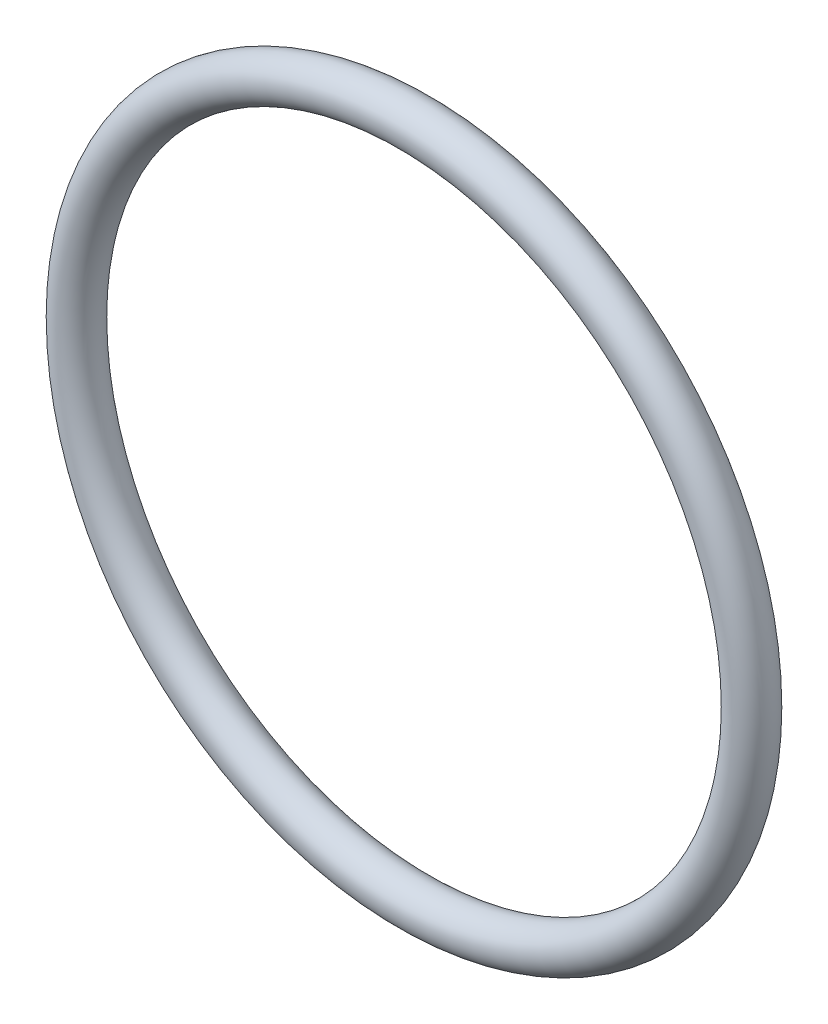
ISO-10303-21;
HEADER;
FILE_DESCRIPTION(('STEP AP214'),'2;1');
FILE_NAME('part.step','',(''),(''),'','','');
FILE_SCHEMA(('AUTOMOTIVE_DESIGN { 1 0 10303 214 1 1 1 1 }'));
ENDSEC;
DATA;
#1=APPLICATION_CONTEXT('core data for automotive mechanical design processes');
#2=APPLICATION_PROTOCOL_DEFINITION('international standard','automotive_design',2000,#1);
#3=PRODUCT_CONTEXT('',#1,'mechanical');
#4=PRODUCT('Part','Part','',(#3));
#5=PRODUCT_RELATED_PRODUCT_CATEGORY('part','',(#4));
#6=PRODUCT_DEFINITION_FORMATION('','',#4);
#7=PRODUCT_DEFINITION_CONTEXT('part definition',#1,'design');
#8=PRODUCT_DEFINITION('design','',#6,#7);
#9=PRODUCT_DEFINITION_SHAPE('','',#8);
#10=(LENGTH_UNIT() NAMED_UNIT(*) SI_UNIT(.MILLI.,.METRE.));
#11=(NAMED_UNIT(*) PLANE_ANGLE_UNIT() SI_UNIT($,.RADIAN.));
#12=(NAMED_UNIT(*) SI_UNIT($,.STERADIAN.) SOLID_ANGLE_UNIT());
#13=UNCERTAINTY_MEASURE_WITH_UNIT(LENGTH_MEASURE(1.E-05),#10,'distance_accuracy_value','');
#14=(GEOMETRIC_REPRESENTATION_CONTEXT(3) GLOBAL_UNCERTAINTY_ASSIGNED_CONTEXT((#13)) GLOBAL_UNIT_ASSIGNED_CONTEXT((#10,
#11,#12)) REPRESENTATION_CONTEXT('',''));
#15=CARTESIAN_POINT('',(0.,0.,0.));
#16=DIRECTION('',(0.,0.,1.));
#17=DIRECTION('',(1.,0.,0.));
#18=AXIS2_PLACEMENT_3D('',#15,#16,#17);
#19=CARTESIAN_POINT('',(0.,0.,0.));
#20=DIRECTION('',(0.,0.,1.));
#21=DIRECTION('',(1.,0.,0.));
#22=AXIS2_PLACEMENT_3D('',#19,#20,#21);
#23=TOROIDAL_SURFACE('',#22,42.037,2.667);
#24=CARTESIAN_POINT('',(44.704,0.,0.));
#25=VERTEX_POINT('',#24);
#26=VERTEX_LOOP('',#25);
#27=FACE_BOUND('',#26,.T.);
#28=ADVANCED_FACE('F31',(#27),#23,.T.);
#29=CLOSED_SHELL('',(#28));
#30=MANIFOLD_SOLID_BREP('B2',#29);
#31=ADVANCED_BREP_SHAPE_REPRESENTATION('',(#18,#30),#14);
#32=SHAPE_DEFINITION_REPRESENTATION(#9,#31);
ENDSEC;
END-ISO-10303-21;
